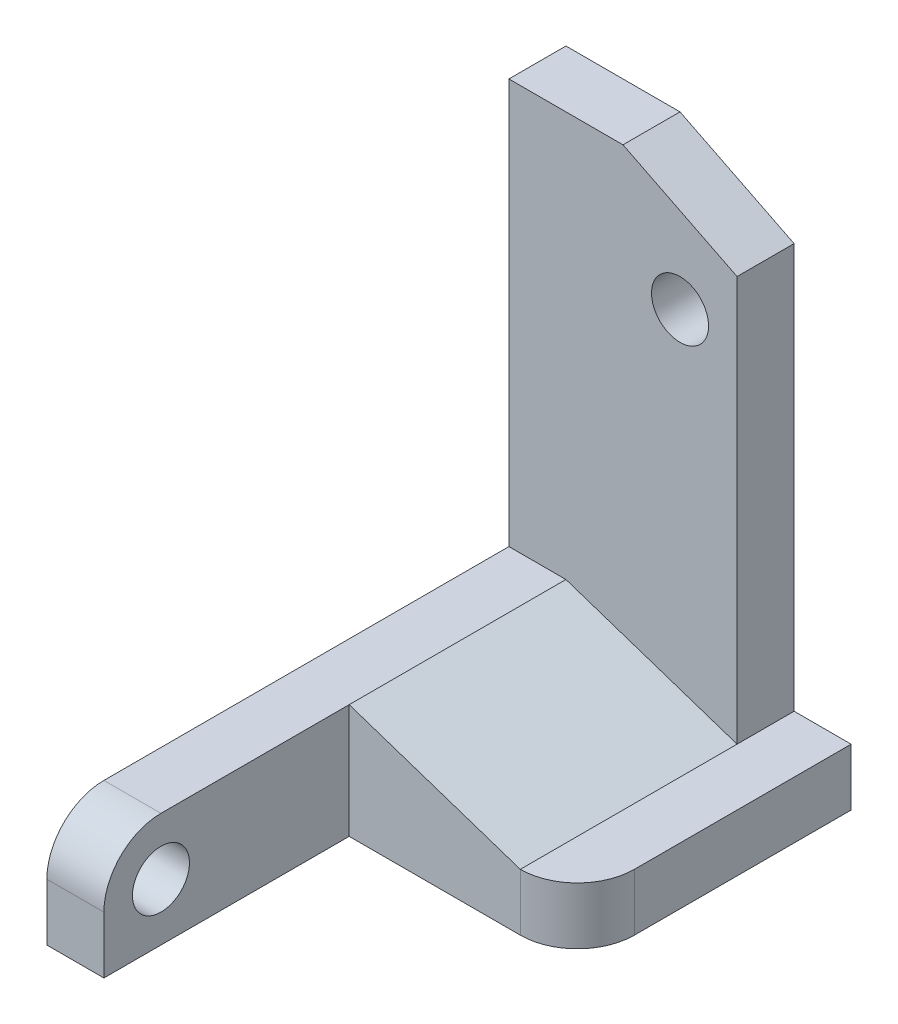
ISO-10303-21;
HEADER;
FILE_DESCRIPTION(('STEP AP214'),'2;1');
FILE_NAME('part.step','',(''),(''),'','','');
FILE_SCHEMA(('AUTOMOTIVE_DESIGN { 1 0 10303 214 1 1 1 1 }'));
ENDSEC;
DATA;
#1=APPLICATION_CONTEXT('core data for automotive mechanical design processes');
#2=APPLICATION_PROTOCOL_DEFINITION('international standard','automotive_design',2000,#1);
#3=PRODUCT_CONTEXT('',#1,'mechanical');
#4=PRODUCT('Part','Part','',(#3));
#5=PRODUCT_RELATED_PRODUCT_CATEGORY('part','',(#4));
#6=PRODUCT_DEFINITION_FORMATION('','',#4);
#7=PRODUCT_DEFINITION_CONTEXT('part definition',#1,'design');
#8=PRODUCT_DEFINITION('design','',#6,#7);
#9=PRODUCT_DEFINITION_SHAPE('','',#8);
#10=(LENGTH_UNIT() NAMED_UNIT(*) SI_UNIT(.MILLI.,.METRE.));
#11=(NAMED_UNIT(*) PLANE_ANGLE_UNIT() SI_UNIT($,.RADIAN.));
#12=(NAMED_UNIT(*) SI_UNIT($,.STERADIAN.) SOLID_ANGLE_UNIT());
#13=UNCERTAINTY_MEASURE_WITH_UNIT(LENGTH_MEASURE(1.E-05),#10,'distance_accuracy_value','');
#14=(GEOMETRIC_REPRESENTATION_CONTEXT(3) GLOBAL_UNCERTAINTY_ASSIGNED_CONTEXT((#13)) GLOBAL_UNIT_ASSIGNED_CONTEXT((#10,
#11,#12)) REPRESENTATION_CONTEXT('',''));
#15=CARTESIAN_POINT('',(0.,0.,0.));
#16=DIRECTION('',(0.,0.,1.));
#17=DIRECTION('',(1.,0.,0.));
#18=AXIS2_PLACEMENT_3D('',#15,#16,#17);
#19=CARTESIAN_POINT('',(1016.,1.2509555207044E-13,254.));
#20=DIRECTION('',(1.,0.,0.));
#21=DIRECTION('',(0.,1.,0.));
#22=AXIS2_PLACEMENT_3D('',#19,#20,#21);
#23=PLANE('',#22);
#24=DIRECTION('',(0.,-1.,0.));
#25=VECTOR('',#24,1.);
#26=CARTESIAN_POINT('',(1016.,1.2509555207044E-13,0.));
#27=LINE('',#26,#25);
#28=CARTESIAN_POINT('',(1016.,2057.4,0.));
#29=VERTEX_POINT('',#28);
#30=CARTESIAN_POINT('',(1016.,254.,0.));
#31=VERTEX_POINT('',#30);
#32=EDGE_CURVE('E217',#29,#31,#27,.T.);
#33=ORIENTED_EDGE('',*,*,#32,.F.);
#34=DIRECTION('',(0.,0.,-1.));
#35=VECTOR('',#34,1.);
#36=CARTESIAN_POINT('',(1016.,2057.4,254.));
#37=LINE('',#36,#35);
#38=CARTESIAN_POINT('',(1016.,2057.4,254.));
#39=VERTEX_POINT('',#38);
#40=EDGE_CURVE('E227',#39,#29,#37,.T.);
#41=ORIENTED_EDGE('',*,*,#40,.F.);
#42=DIRECTION('',(0.,-1.,0.));
#43=VECTOR('',#42,1.);
#44=CARTESIAN_POINT('',(1016.,1.2509555207044E-13,254.));
#45=LINE('',#44,#43);
#46=CARTESIAN_POINT('',(1016.,254.,254.));
#47=VERTEX_POINT('',#46);
#48=EDGE_CURVE('E204',#39,#47,#45,.T.);
#49=ORIENTED_EDGE('',*,*,#48,.T.);
#50=DIRECTION('',(0.,0.,-1.));
#51=VECTOR('',#50,1.);
#52=CARTESIAN_POINT('',(1016.,254.,254.));
#53=LINE('',#52,#51);
#54=EDGE_CURVE('E229',#47,#31,#53,.T.);
#55=ORIENTED_EDGE('',*,*,#54,.T.);
#56=EDGE_LOOP('',(#33,#41,#49,#55));
#57=FACE_BOUND('',#56,.T.);
#58=ADVANCED_FACE('F37',(#57),#23,.T.);
#59=CARTESIAN_POINT('',(1026.16,2052.32,254.));
#60=DIRECTION('',(0.447213595499958,0.894427190999916,0.));
#61=DIRECTION('',(-0.894427190999916,0.447213595499958,0.));
#62=AXIS2_PLACEMENT_3D('',#59,#60,#61);
#63=PLANE('',#62);
#64=DIRECTION('',(0.894427190999916,-0.447213595499958,0.));
#65=VECTOR('',#64,1.);
#66=CARTESIAN_POINT('',(1026.16,2052.32,0.));
#67=LINE('',#66,#65);
#68=CARTESIAN_POINT('',(508.,2311.4,0.));
#69=VERTEX_POINT('',#68);
#70=EDGE_CURVE('E220',#69,#29,#67,.T.);
#71=ORIENTED_EDGE('',*,*,#70,.F.);
#72=DIRECTION('',(0.,0.,-1.));
#73=VECTOR('',#72,1.);
#74=CARTESIAN_POINT('',(508.,2311.4,254.));
#75=LINE('',#74,#73);
#76=CARTESIAN_POINT('',(508.,2311.4,254.));
#77=VERTEX_POINT('',#76);
#78=EDGE_CURVE('E225',#77,#69,#75,.T.);
#79=ORIENTED_EDGE('',*,*,#78,.F.);
#80=DIRECTION('',(0.894427190999916,-0.447213595499958,0.));
#81=VECTOR('',#80,1.);
#82=CARTESIAN_POINT('',(1026.16,2052.32,254.));
#83=LINE('',#82,#81);
#84=EDGE_CURVE('E207',#77,#39,#83,.T.);
#85=ORIENTED_EDGE('',*,*,#84,.T.);
#86=ORIENTED_EDGE('',*,*,#40,.T.);
#87=EDGE_LOOP('',(#71,#79,#85,#86));
#88=FACE_BOUND('',#87,.T.);
#89=ADVANCED_FACE('F278',(#88),#63,.T.);
#90=CARTESIAN_POINT('',(0.,2311.4,254.));
#91=DIRECTION('',(0.,1.,0.));
#92=DIRECTION('',(0.,0.,1.));
#93=AXIS2_PLACEMENT_3D('',#90,#91,#92);
#94=PLANE('',#93);
#95=DIRECTION('',(1.,0.,0.));
#96=VECTOR('',#95,1.);
#97=CARTESIAN_POINT('',(0.,2311.4,0.));
#98=LINE('',#97,#96);
#99=CARTESIAN_POINT('',(0.,2311.4,0.));
#100=VERTEX_POINT('',#99);
#101=EDGE_CURVE('E141',#100,#69,#98,.T.);
#102=ORIENTED_EDGE('',*,*,#101,.F.);
#103=DIRECTION('',(0.,0.,-1.));
#104=VECTOR('',#103,1.);
#105=CARTESIAN_POINT('',(0.,2311.4,254.));
#106=LINE('',#105,#104);
#107=CARTESIAN_POINT('',(0.,2311.4,254.));
#108=VERTEX_POINT('',#107);
#109=EDGE_CURVE('E136',#108,#100,#106,.T.);
#110=ORIENTED_EDGE('',*,*,#109,.F.);
#111=DIRECTION('',(1.,0.,0.));
#112=VECTOR('',#111,1.);
#113=CARTESIAN_POINT('',(0.,2311.4,254.));
#114=LINE('',#113,#112);
#115=EDGE_CURVE('E210',#108,#77,#114,.T.);
#116=ORIENTED_EDGE('',*,*,#115,.T.);
#117=ORIENTED_EDGE('',*,*,#78,.T.);
#118=EDGE_LOOP('',(#102,#110,#116,#117));
#119=FACE_BOUND('',#118,.T.);
#120=ADVANCED_FACE('F284',(#119),#94,.T.);
#121=CARTESIAN_POINT('',(762.,1803.4,254.));
#122=DIRECTION('',(0.,0.,-1.));
#123=DIRECTION('',(-1.,0.,0.));
#124=AXIS2_PLACEMENT_3D('',#121,#122,#123);
#125=CYLINDRICAL_SURFACE('',#124,127.);
#126=CARTESIAN_POINT('',(762.,1803.4,254.));
#127=DIRECTION('',(0.,0.,1.));
#128=DIRECTION('',(1.,0.,0.));
#129=AXIS2_PLACEMENT_3D('',#126,#127,#128);
#130=CIRCLE('',#129,127.);
#131=CARTESIAN_POINT('',(889.,1803.4,254.));
#132=VERTEX_POINT('',#131);
#133=EDGE_CURVE('E140',#132,#132,#130,.T.);
#134=ORIENTED_EDGE('',*,*,#133,.T.);
#135=EDGE_LOOP('',(#134));
#136=FACE_BOUND('',#135,.T.);
#137=CARTESIAN_POINT('',(762.,1803.4,0.));
#138=DIRECTION('',(0.,0.,1.));
#139=DIRECTION('',(1.,0.,0.));
#140=AXIS2_PLACEMENT_3D('',#137,#138,#139);
#141=CIRCLE('',#140,127.);
#142=CARTESIAN_POINT('',(889.,1803.4,0.));
#143=VERTEX_POINT('',#142);
#144=EDGE_CURVE('E195',#143,#143,#141,.T.);
#145=ORIENTED_EDGE('',*,*,#144,.F.);
#146=EDGE_LOOP('',(#145));
#147=FACE_BOUND('',#146,.T.);
#148=ADVANCED_FACE('F290',(#136,#147),#125,.F.);
#149=CARTESIAN_POINT('',(0.,0.,254.));
#150=DIRECTION('',(-1.,0.,0.));
#151=DIRECTION('',(0.,0.,1.));
#152=AXIS2_PLACEMENT_3D('',#149,#150,#151);
#153=PLANE('',#152);
#154=DIRECTION('',(0.,1.,0.));
#155=VECTOR('',#154,1.);
#156=CARTESIAN_POINT('',(0.,508.,2311.4));
#157=LINE('',#156,#155);
#158=CARTESIAN_POINT('',(0.,0.,2311.4));
#159=VERTEX_POINT('',#158);
#160=CARTESIAN_POINT('',(0.,254.,2311.4));
#161=VERTEX_POINT('',#160);
#162=EDGE_CURVE('E157',#159,#161,#157,.T.);
#163=ORIENTED_EDGE('',*,*,#162,.T.);
#164=CARTESIAN_POINT('',(0.,254.,2057.4));
#165=DIRECTION('',(-1.,0.,0.));
#166=DIRECTION('',(0.,0.,1.));
#167=AXIS2_PLACEMENT_3D('',#164,#165,#166);
#168=CIRCLE('',#167,254.);
#169=CARTESIAN_POINT('',(0.,508.,2057.4));
#170=VERTEX_POINT('',#169);
#171=EDGE_CURVE('E11',#161,#170,#168,.T.);
#172=ORIENTED_EDGE('',*,*,#171,.T.);
#173=DIRECTION('',(0.,0.,-1.));
#174=VECTOR('',#173,1.);
#175=CARTESIAN_POINT('',(0.,508.,0.));
#176=LINE('',#175,#174);
#177=CARTESIAN_POINT('',(0.,508.,254.));
#178=VERTEX_POINT('',#177);
#179=EDGE_CURVE('E160',#170,#178,#176,.T.);
#180=ORIENTED_EDGE('',*,*,#179,.T.);
#181=DIRECTION('',(0.,1.,0.));
#182=VECTOR('',#181,1.);
#183=CARTESIAN_POINT('',(0.,0.,254.));
#184=LINE('',#183,#182);
#185=EDGE_CURVE('E213',#178,#108,#184,.T.);
#186=ORIENTED_EDGE('',*,*,#185,.T.);
#187=ORIENTED_EDGE('',*,*,#109,.T.);
#188=DIRECTION('',(0.,1.,0.));
#189=VECTOR('',#188,1.);
#190=CARTESIAN_POINT('',(0.,0.,0.));
#191=LINE('',#190,#189);
#192=CARTESIAN_POINT('',(0.,0.,0.));
#193=VERTEX_POINT('',#192);
#194=EDGE_CURVE('E128',#193,#100,#191,.T.);
#195=ORIENTED_EDGE('',*,*,#194,.F.);
#196=DIRECTION('',(0.,0.,1.));
#197=VECTOR('',#196,1.);
#198=CARTESIAN_POINT('',(0.,0.,0.));
#199=LINE('',#198,#197);
#200=EDGE_CURVE('E133',#193,#159,#199,.T.);
#201=ORIENTED_EDGE('',*,*,#200,.T.);
#202=EDGE_LOOP('',(#163,#172,#180,#186,#187,#195,#201));
#203=FACE_BOUND('',#202,.T.);
#204=CARTESIAN_POINT('',(0.,254.,2057.4));
#205=DIRECTION('',(-1.,0.,0.));
#206=DIRECTION('',(0.,-1.,0.));
#207=AXIS2_PLACEMENT_3D('',#204,#205,#206);
#208=CIRCLE('',#207,127.);
#209=CARTESIAN_POINT('',(0.,127.,2057.4));
#210=VERTEX_POINT('',#209);
#211=EDGE_CURVE('E171',#210,#210,#208,.T.);
#212=ORIENTED_EDGE('',*,*,#211,.F.);
#213=EDGE_LOOP('',(#212));
#214=FACE_BOUND('',#213,.T.);
#215=ADVANCED_FACE('F130',(#203,#214),#153,.T.);
#216=CARTESIAN_POINT('',(0.,0.,254.));
#217=DIRECTION('',(0.,0.,1.));
#218=DIRECTION('',(1.,0.,0.));
#219=AXIS2_PLACEMENT_3D('',#216,#217,#218);
#220=PLANE('',#219);
#221=ORIENTED_EDGE('',*,*,#133,.F.);
#222=EDGE_LOOP('',(#221));
#223=FACE_BOUND('',#222,.T.);
#224=DIRECTION('',(-1.,0.,0.));
#225=VECTOR('',#224,1.);
#226=CARTESIAN_POINT('',(-2.22044604925031E-13,508.,254.));
#227=LINE('',#226,#225);
#228=CARTESIAN_POINT('',(254.,508.,254.));
#229=VERTEX_POINT('',#228);
#230=EDGE_CURVE('E198',#229,#178,#227,.T.);
#231=ORIENTED_EDGE('',*,*,#230,.F.);
#232=DIRECTION('',(-0.948683298050514,0.316227766016838,0.));
#233=VECTOR('',#232,1.);
#234=CARTESIAN_POINT('',(177.8,533.4,254.));
#235=LINE('',#234,#233);
#236=EDGE_CURVE('E201',#47,#229,#235,.T.);
#237=ORIENTED_EDGE('',*,*,#236,.F.);
#238=ORIENTED_EDGE('',*,*,#48,.F.);
#239=ORIENTED_EDGE('',*,*,#84,.F.);
#240=ORIENTED_EDGE('',*,*,#115,.F.);
#241=ORIENTED_EDGE('',*,*,#185,.F.);
#242=EDGE_LOOP('',(#231,#237,#238,#239,#240,#241));
#243=FACE_BOUND('',#242,.T.);
#244=ADVANCED_FACE('F268',(#223,#243),#220,.T.);
#245=CARTESIAN_POINT('',(0.,0.,0.));
#246=DIRECTION('',(0.,0.,1.));
#247=DIRECTION('',(1.,0.,0.));
#248=AXIS2_PLACEMENT_3D('',#245,#246,#247);
#249=PLANE('',#248);
#250=DIRECTION('',(-1.,0.,0.));
#251=VECTOR('',#250,1.);
#252=CARTESIAN_POINT('',(0.,0.,0.));
#253=LINE('',#252,#251);
#254=CARTESIAN_POINT('',(1270.,0.,0.));
#255=VERTEX_POINT('',#254);
#256=EDGE_CURVE('E145',#255,#193,#253,.T.);
#257=ORIENTED_EDGE('',*,*,#256,.T.);
#258=ORIENTED_EDGE('',*,*,#194,.T.);
#259=ORIENTED_EDGE('',*,*,#101,.T.);
#260=ORIENTED_EDGE('',*,*,#70,.T.);
#261=ORIENTED_EDGE('',*,*,#32,.T.);
#262=DIRECTION('',(1.,0.,0.));
#263=VECTOR('',#262,1.);
#264=CARTESIAN_POINT('',(0.,254.,0.));
#265=LINE('',#264,#263);
#266=CARTESIAN_POINT('',(1270.,254.,0.));
#267=VERTEX_POINT('',#266);
#268=EDGE_CURVE('E178',#31,#267,#265,.T.);
#269=ORIENTED_EDGE('',*,*,#268,.T.);
#270=DIRECTION('',(0.,-1.,0.));
#271=VECTOR('',#270,1.);
#272=CARTESIAN_POINT('',(1270.,0.,0.));
#273=LINE('',#272,#271);
#274=EDGE_CURVE('E150',#267,#255,#273,.T.);
#275=ORIENTED_EDGE('',*,*,#274,.T.);
#276=EDGE_LOOP('',(#257,#258,#259,#260,#261,#269,#275));
#277=FACE_BOUND('',#276,.T.);
#278=ORIENTED_EDGE('',*,*,#144,.T.);
#279=EDGE_LOOP('',(#278));
#280=FACE_BOUND('',#279,.T.);
#281=ADVANCED_FACE('F146',(#277,#280),#249,.F.);
#282=CARTESIAN_POINT('',(177.8,533.4,1219.2));
#283=DIRECTION('',(-0.316227766016838,-0.948683298050514,0.));
#284=DIRECTION('',(0.948683298050514,-0.316227766016838,0.));
#285=AXIS2_PLACEMENT_3D('',#282,#283,#284);
#286=PLANE('',#285);
#287=ORIENTED_EDGE('',*,*,#236,.T.);
#288=DIRECTION('',(0.,0.,-1.));
#289=VECTOR('',#288,1.);
#290=CARTESIAN_POINT('',(254.,508.,1219.2));
#291=LINE('',#290,#289);
#292=CARTESIAN_POINT('',(254.,508.,1219.2));
#293=VERTEX_POINT('',#292);
#294=EDGE_CURVE('E193',#293,#229,#291,.T.);
#295=ORIENTED_EDGE('',*,*,#294,.F.);
#296=DIRECTION('',(-0.948683298050514,0.316227766016838,0.));
#297=VECTOR('',#296,1.);
#298=CARTESIAN_POINT('',(177.8,533.4,1219.2));
#299=LINE('',#298,#297);
#300=CARTESIAN_POINT('',(1016.,254.,1219.2));
#301=VERTEX_POINT('',#300);
#302=EDGE_CURVE('E174',#301,#293,#299,.T.);
#303=ORIENTED_EDGE('',*,*,#302,.F.);
#304=DIRECTION('',(0.,0.,-1.));
#305=VECTOR('',#304,1.);
#306=CARTESIAN_POINT('',(1016.,254.,1219.2));
#307=LINE('',#306,#305);
#308=EDGE_CURVE('E183',#301,#47,#307,.T.);
#309=ORIENTED_EDGE('',*,*,#308,.T.);
#310=EDGE_LOOP('',(#287,#295,#303,#309));
#311=FACE_BOUND('',#310,.T.);
#312=ADVANCED_FACE('F262',(#311),#286,.F.);
#313=CARTESIAN_POINT('',(0.,0.,1219.2));
#314=DIRECTION('',(0.,-1.,0.));
#315=DIRECTION('',(1.,0.,0.));
#316=AXIS2_PLACEMENT_3D('',#313,#314,#315);
#317=PLANE('',#316);
#318=DIRECTION('',(0.,0.,-1.));
#319=VECTOR('',#318,1.);
#320=CARTESIAN_POINT('',(1270.,0.,1219.2));
#321=LINE('',#320,#319);
#322=CARTESIAN_POINT('',(1270.,0.,965.2));
#323=VERTEX_POINT('',#322);
#324=EDGE_CURVE('E191',#323,#255,#321,.T.);
#325=ORIENTED_EDGE('',*,*,#324,.F.);
#326=CARTESIAN_POINT('',(1016.,0.,965.2));
#327=DIRECTION('',(0.,-1.,0.));
#328=DIRECTION('',(1.,0.,0.));
#329=AXIS2_PLACEMENT_3D('',#326,#327,#328);
#330=CIRCLE('',#329,254.);
#331=CARTESIAN_POINT('',(1016.,0.,1219.2));
#332=VERTEX_POINT('',#331);
#333=EDGE_CURVE('E235',#323,#332,#330,.T.);
#334=ORIENTED_EDGE('',*,*,#333,.T.);
#335=DIRECTION('',(-1.,0.,0.));
#336=VECTOR('',#335,1.);
#337=CARTESIAN_POINT('',(0.,0.,1219.2));
#338=LINE('',#337,#336);
#339=CARTESIAN_POINT('',(254.,0.,1219.2));
#340=VERTEX_POINT('',#339);
#341=EDGE_CURVE('E181',#332,#340,#338,.T.);
#342=ORIENTED_EDGE('',*,*,#341,.T.);
#343=DIRECTION('',(0.,0.,1.));
#344=VECTOR('',#343,1.);
#345=CARTESIAN_POINT('',(254.,0.,0.));
#346=LINE('',#345,#344);
#347=CARTESIAN_POINT('',(254.,0.,2311.4));
#348=VERTEX_POINT('',#347);
#349=EDGE_CURVE('E169',#340,#348,#346,.T.);
#350=ORIENTED_EDGE('',*,*,#349,.T.);
#351=DIRECTION('',(1.,0.,0.));
#352=VECTOR('',#351,1.);
#353=CARTESIAN_POINT('',(0.,0.,2311.4));
#354=LINE('',#353,#352);
#355=EDGE_CURVE('E153',#159,#348,#354,.T.);
#356=ORIENTED_EDGE('',*,*,#355,.F.);
#357=ORIENTED_EDGE('',*,*,#200,.F.);
#358=ORIENTED_EDGE('',*,*,#256,.F.);
#359=EDGE_LOOP('',(#325,#334,#342,#350,#356,#357,#358));
#360=FACE_BOUND('',#359,.T.);
#361=ADVANCED_FACE('F155',(#360),#317,.T.);
#362=CARTESIAN_POINT('',(1270.,0.,1219.2));
#363=DIRECTION('',(1.,0.,0.));
#364=DIRECTION('',(0.,0.,-1.));
#365=AXIS2_PLACEMENT_3D('',#362,#363,#364);
#366=PLANE('',#365);
#367=DIRECTION('',(0.,0.,-1.));
#368=VECTOR('',#367,1.);
#369=CARTESIAN_POINT('',(1270.,254.,1219.2));
#370=LINE('',#369,#368);
#371=CARTESIAN_POINT('',(1270.,254.,965.2));
#372=VERTEX_POINT('',#371);
#373=EDGE_CURVE('E189',#372,#267,#370,.T.);
#374=ORIENTED_EDGE('',*,*,#373,.F.);
#375=DIRECTION('',(0.,-1.,0.));
#376=VECTOR('',#375,1.);
#377=CARTESIAN_POINT('',(1270.,0.,965.2));
#378=LINE('',#377,#376);
#379=EDGE_CURVE('E232',#372,#323,#378,.T.);
#380=ORIENTED_EDGE('',*,*,#379,.T.);
#381=ORIENTED_EDGE('',*,*,#324,.T.);
#382=ORIENTED_EDGE('',*,*,#274,.F.);
#383=EDGE_LOOP('',(#374,#380,#381,#382));
#384=FACE_BOUND('',#383,.T.);
#385=ADVANCED_FACE('F308',(#384),#366,.T.);
#386=CARTESIAN_POINT('',(0.,254.,1219.2));
#387=DIRECTION('',(0.,1.,0.));
#388=DIRECTION('',(-1.,0.,0.));
#389=AXIS2_PLACEMENT_3D('',#386,#387,#388);
#390=PLANE('',#389);
#391=ORIENTED_EDGE('',*,*,#308,.F.);
#392=CARTESIAN_POINT('',(1016.,254.,965.2));
#393=DIRECTION('',(0.,1.,0.));
#394=DIRECTION('',(-1.,0.,0.));
#395=AXIS2_PLACEMENT_3D('',#392,#393,#394);
#396=CIRCLE('',#395,254.);
#397=EDGE_CURVE('E239',#301,#372,#396,.T.);
#398=ORIENTED_EDGE('',*,*,#397,.T.);
#399=ORIENTED_EDGE('',*,*,#373,.T.);
#400=ORIENTED_EDGE('',*,*,#268,.F.);
#401=ORIENTED_EDGE('',*,*,#54,.F.);
#402=EDGE_LOOP('',(#391,#398,#399,#400,#401));
#403=FACE_BOUND('',#402,.T.);
#404=ADVANCED_FACE('F302',(#403),#390,.T.);
#405=CARTESIAN_POINT('',(0.,0.,1219.2));
#406=DIRECTION('',(0.,0.,1.));
#407=DIRECTION('',(1.,0.,0.));
#408=AXIS2_PLACEMENT_3D('',#405,#406,#407);
#409=PLANE('',#408);
#410=ORIENTED_EDGE('',*,*,#341,.F.);
#411=DIRECTION('',(0.,-1.,0.));
#412=VECTOR('',#411,1.);
#413=CARTESIAN_POINT('',(1016.,0.,1219.2));
#414=LINE('',#413,#412);
#415=EDGE_CURVE('E237',#332,#301,#414,.F.);
#416=ORIENTED_EDGE('',*,*,#415,.T.);
#417=ORIENTED_EDGE('',*,*,#302,.T.);
#418=DIRECTION('',(0.,-1.,0.));
#419=VECTOR('',#418,1.);
#420=CARTESIAN_POINT('',(254.,0.,1219.2));
#421=LINE('',#420,#419);
#422=EDGE_CURVE('E177',#293,#340,#421,.T.);
#423=ORIENTED_EDGE('',*,*,#422,.T.);
#424=EDGE_LOOP('',(#410,#416,#417,#423));
#425=FACE_BOUND('',#424,.T.);
#426=ADVANCED_FACE('F257',(#425),#409,.T.);
#427=CARTESIAN_POINT('',(1016.,0.,965.2));
#428=DIRECTION('',(0.,-1.,0.));
#429=DIRECTION('',(0.,0.,-1.));
#430=AXIS2_PLACEMENT_3D('',#427,#428,#429);
#431=CYLINDRICAL_SURFACE('',#430,254.);
#432=ORIENTED_EDGE('',*,*,#397,.F.);
#433=ORIENTED_EDGE('',*,*,#415,.F.);
#434=ORIENTED_EDGE('',*,*,#333,.F.);
#435=ORIENTED_EDGE('',*,*,#379,.F.);
#436=EDGE_LOOP('',(#432,#433,#434,#435));
#437=FACE_BOUND('',#436,.T.);
#438=ADVANCED_FACE('F293',(#437),#431,.T.);
#439=CARTESIAN_POINT('',(254.,0.,0.));
#440=DIRECTION('',(1.,0.,0.));
#441=DIRECTION('',(0.,1.,0.));
#442=AXIS2_PLACEMENT_3D('',#439,#440,#441);
#443=PLANE('',#442);
#444=DIRECTION('',(0.,0.,-1.));
#445=VECTOR('',#444,1.);
#446=CARTESIAN_POINT('',(254.,508.,0.));
#447=LINE('',#446,#445);
#448=CARTESIAN_POINT('',(254.,508.,2057.4));
#449=VERTEX_POINT('',#448);
#450=EDGE_CURVE('E158',#449,#293,#447,.T.);
#451=ORIENTED_EDGE('',*,*,#450,.F.);
#452=CARTESIAN_POINT('',(254.,254.,2057.4));
#453=DIRECTION('',(1.,0.,0.));
#454=DIRECTION('',(0.,1.,0.));
#455=AXIS2_PLACEMENT_3D('',#452,#453,#454);
#456=CIRCLE('',#455,254.);
#457=CARTESIAN_POINT('',(254.,254.,2311.4));
#458=VERTEX_POINT('',#457);
#459=EDGE_CURVE('E59',#449,#458,#456,.T.);
#460=ORIENTED_EDGE('',*,*,#459,.T.);
#461=DIRECTION('',(0.,1.,0.));
#462=VECTOR('',#461,1.);
#463=CARTESIAN_POINT('',(254.,508.,2311.4));
#464=LINE('',#463,#462);
#465=EDGE_CURVE('E162',#348,#458,#464,.T.);
#466=ORIENTED_EDGE('',*,*,#465,.F.);
#467=ORIENTED_EDGE('',*,*,#349,.F.);
#468=ORIENTED_EDGE('',*,*,#422,.F.);
#469=EDGE_LOOP('',(#451,#460,#466,#467,#468));
#470=FACE_BOUND('',#469,.T.);
#471=CARTESIAN_POINT('',(254.,254.,2057.4));
#472=DIRECTION('',(-1.,0.,0.));
#473=DIRECTION('',(0.,-1.,0.));
#474=AXIS2_PLACEMENT_3D('',#471,#472,#473);
#475=CIRCLE('',#474,127.);
#476=CARTESIAN_POINT('',(254.,127.,2057.4));
#477=VERTEX_POINT('',#476);
#478=EDGE_CURVE('E165',#477,#477,#475,.T.);
#479=ORIENTED_EDGE('',*,*,#478,.T.);
#480=EDGE_LOOP('',(#479));
#481=FACE_BOUND('',#480,.T.);
#482=ADVANCED_FACE('F251',(#470,#481),#443,.T.);
#483=CARTESIAN_POINT('',(0.,508.,2311.4));
#484=DIRECTION('',(0.,0.,-1.));
#485=DIRECTION('',(-1.,0.,0.));
#486=AXIS2_PLACEMENT_3D('',#483,#484,#485);
#487=PLANE('',#486);
#488=ORIENTED_EDGE('',*,*,#465,.T.);
#489=DIRECTION('',(1.,0.,0.));
#490=VECTOR('',#489,1.);
#491=CARTESIAN_POINT('',(0.,254.,2311.4));
#492=LINE('',#491,#490);
#493=EDGE_CURVE('E45',#458,#161,#492,.F.);
#494=ORIENTED_EDGE('',*,*,#493,.T.);
#495=ORIENTED_EDGE('',*,*,#162,.F.);
#496=ORIENTED_EDGE('',*,*,#355,.T.);
#497=EDGE_LOOP('',(#488,#494,#495,#496));
#498=FACE_BOUND('',#497,.T.);
#499=ADVANCED_FACE('F300',(#498),#487,.F.);
#500=CARTESIAN_POINT('',(0.,508.,0.));
#501=DIRECTION('',(0.,-1.,0.));
#502=DIRECTION('',(1.,0.,0.));
#503=AXIS2_PLACEMENT_3D('',#500,#501,#502);
#504=PLANE('',#503);
#505=ORIENTED_EDGE('',*,*,#179,.F.);
#506=DIRECTION('',(1.,0.,0.));
#507=VECTOR('',#506,1.);
#508=CARTESIAN_POINT('',(0.,508.,2057.4));
#509=LINE('',#508,#507);
#510=EDGE_CURVE('E241',#170,#449,#509,.T.);
#511=ORIENTED_EDGE('',*,*,#510,.T.);
#512=ORIENTED_EDGE('',*,*,#450,.T.);
#513=ORIENTED_EDGE('',*,*,#294,.T.);
#514=ORIENTED_EDGE('',*,*,#230,.T.);
#515=EDGE_LOOP('',(#505,#511,#512,#513,#514));
#516=FACE_BOUND('',#515,.T.);
#517=ADVANCED_FACE('F247',(#516),#504,.F.);
#518=CARTESIAN_POINT('',(0.,254.,2057.4));
#519=DIRECTION('',(1.,0.,0.));
#520=DIRECTION('',(0.,1.,0.));
#521=AXIS2_PLACEMENT_3D('',#518,#519,#520);
#522=CYLINDRICAL_SURFACE('',#521,127.);
#523=ORIENTED_EDGE('',*,*,#211,.T.);
#524=EDGE_LOOP('',(#523));
#525=FACE_BOUND('',#524,.T.);
#526=ORIENTED_EDGE('',*,*,#478,.F.);
#527=EDGE_LOOP('',(#526));
#528=FACE_BOUND('',#527,.T.);
#529=ADVANCED_FACE('F271',(#525,#528),#522,.F.);
#530=CARTESIAN_POINT('',(0.,254.,2057.4));
#531=DIRECTION('',(1.,0.,0.));
#532=DIRECTION('',(0.,1.,0.));
#533=AXIS2_PLACEMENT_3D('',#530,#531,#532);
#534=CYLINDRICAL_SURFACE('',#533,254.);
#535=ORIENTED_EDGE('',*,*,#171,.F.);
#536=ORIENTED_EDGE('',*,*,#493,.F.);
#537=ORIENTED_EDGE('',*,*,#459,.F.);
#538=ORIENTED_EDGE('',*,*,#510,.F.);
#539=EDGE_LOOP('',(#535,#536,#537,#538));
#540=FACE_BOUND('',#539,.T.);
#541=ADVANCED_FACE('F39',(#540),#534,.T.);
#542=CLOSED_SHELL('',(#58,#89,#120,#148,#215,#244,#281,#312,#361,#385,#404,#426,#438,#482,#499,
#517,#529,#541));
#543=MANIFOLD_SOLID_BREP('B2',#542);
#544=ADVANCED_BREP_SHAPE_REPRESENTATION('',(#18,#543),#14);
#545=SHAPE_DEFINITION_REPRESENTATION(#9,#544);
ENDSEC;
END-ISO-10303-21;
